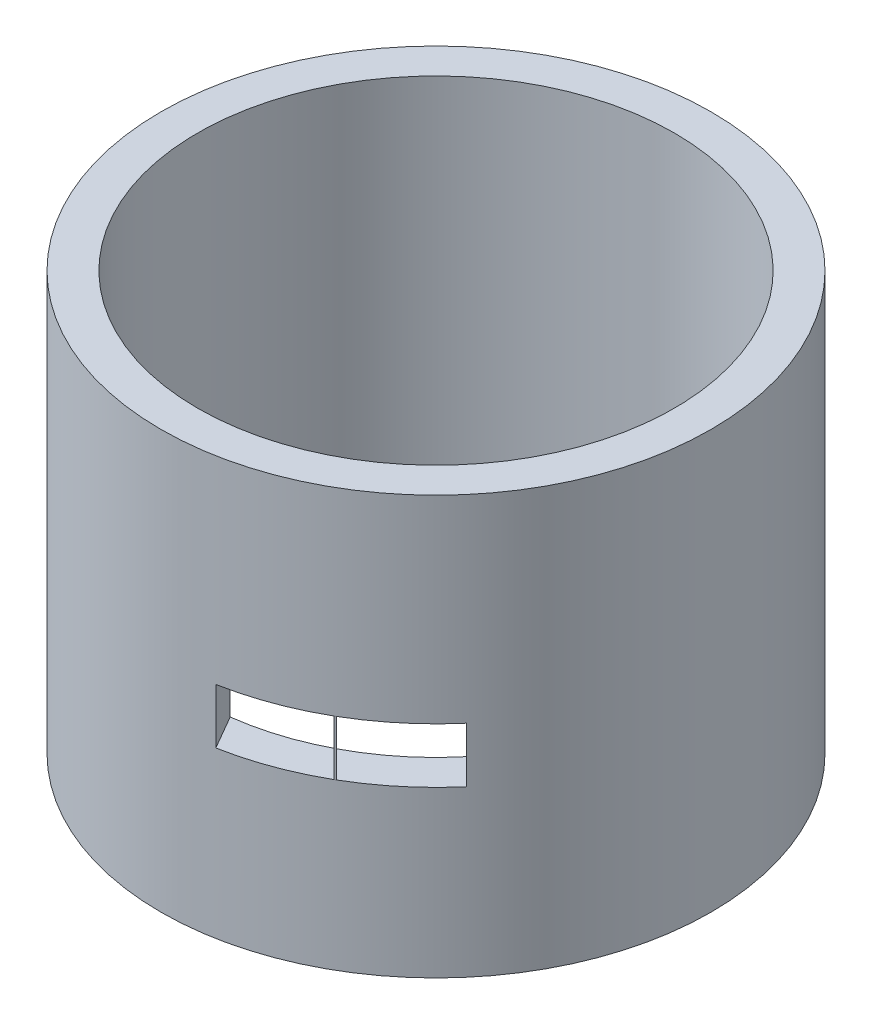
ISO-10303-21;
HEADER;
FILE_DESCRIPTION(('STEP AP214'),'2;1');
FILE_NAME('part.step','',(''),(''),'','','');
FILE_SCHEMA(('AUTOMOTIVE_DESIGN { 1 0 10303 214 1 1 1 1 }'));
ENDSEC;
DATA;
#1=APPLICATION_CONTEXT('core data for automotive mechanical design processes');
#2=APPLICATION_PROTOCOL_DEFINITION('international standard','automotive_design',2000,#1);
#3=PRODUCT_CONTEXT('',#1,'mechanical');
#4=PRODUCT('Part','Part','',(#3));
#5=PRODUCT_RELATED_PRODUCT_CATEGORY('part','',(#4));
#6=PRODUCT_DEFINITION_FORMATION('','',#4);
#7=PRODUCT_DEFINITION_CONTEXT('part definition',#1,'design');
#8=PRODUCT_DEFINITION('design','',#6,#7);
#9=PRODUCT_DEFINITION_SHAPE('','',#8);
#10=(LENGTH_UNIT() NAMED_UNIT(*) SI_UNIT(.MILLI.,.METRE.));
#11=(NAMED_UNIT(*) PLANE_ANGLE_UNIT() SI_UNIT($,.RADIAN.));
#12=(NAMED_UNIT(*) SI_UNIT($,.STERADIAN.) SOLID_ANGLE_UNIT());
#13=UNCERTAINTY_MEASURE_WITH_UNIT(LENGTH_MEASURE(1.E-05),#10,'distance_accuracy_value','');
#14=(GEOMETRIC_REPRESENTATION_CONTEXT(3) GLOBAL_UNCERTAINTY_ASSIGNED_CONTEXT((#13)) GLOBAL_UNIT_ASSIGNED_CONTEXT((#10,
#11,#12)) REPRESENTATION_CONTEXT('',''));
#15=CARTESIAN_POINT('',(0.,0.,0.));
#16=DIRECTION('',(0.,0.,1.));
#17=DIRECTION('',(1.,0.,0.));
#18=AXIS2_PLACEMENT_3D('',#15,#16,#17);
#19=CARTESIAN_POINT('',(0.,114.,0.));
#20=DIRECTION('',(0.,-1.,0.));
#21=DIRECTION('',(0.,0.,-1.));
#22=AXIS2_PLACEMENT_3D('',#19,#20,#21);
#23=CYLINDRICAL_SURFACE('',#22,75.);
#24=CARTESIAN_POINT('',(0.,45.,0.));
#25=DIRECTION('',(0.,-1.,0.));
#26=DIRECTION('',(0.,0.,-1.));
#27=AXIS2_PLACEMENT_3D('',#24,#25,#26);
#28=CIRCLE('',#27,75.);
#29=CARTESIAN_POINT('',(37.2554238093111,45.0000000000005,65.0924987751171));
#30=VERTEX_POINT('',#29);
#31=CARTESIAN_POINT('',(13.7047039647165,45.0000000000005,73.7372435695794));
#32=VERTEX_POINT('',#31);
#33=EDGE_CURVE('E92',#30,#32,#28,.T.);
#34=ORIENTED_EDGE('',*,*,#33,.T.);
#35=DIRECTION('',(0.,-1.,0.));
#36=VECTOR('',#35,1.);
#37=CARTESIAN_POINT('',(13.7047039647165,114.,73.7372435695794));
#38=LINE('',#37,#36);
#39=CARTESIAN_POINT('',(13.7047039647165,60.0000000000005,73.7372435695795));
#40=VERTEX_POINT('',#39);
#41=EDGE_CURVE('E107',#32,#40,#38,.F.);
#42=ORIENTED_EDGE('',*,*,#41,.T.);
#43=CARTESIAN_POINT('',(0.,60.,0.));
#44=DIRECTION('',(0.,1.,0.));
#45=DIRECTION('',(0.,0.,1.));
#46=AXIS2_PLACEMENT_3D('',#43,#44,#45);
#47=CIRCLE('',#46,75.);
#48=CARTESIAN_POINT('',(37.2554238093113,60.0000000000005,65.0924987751174));
#49=VERTEX_POINT('',#48);
#50=EDGE_CURVE('E106',#40,#49,#47,.T.);
#51=ORIENTED_EDGE('',*,*,#50,.T.);
#52=DIRECTION('',(0.,-1.,0.));
#53=VECTOR('',#52,1.);
#54=CARTESIAN_POINT('',(37.2554238093111,114.,65.0924987751171));
#55=LINE('',#54,#53);
#56=EDGE_CURVE('E11',#49,#30,#55,.T.);
#57=ORIENTED_EDGE('',*,*,#56,.T.);
#58=EDGE_LOOP('',(#34,#42,#51,#57));
#59=FACE_BOUND('',#58,.T.);
#60=DIRECTION('',(0.,-1.,0.));
#61=VECTOR('',#60,1.);
#62=CARTESIAN_POINT('',(37.7440456304035,114.,64.8103928351775));
#63=LINE('',#62,#61);
#64=CARTESIAN_POINT('',(37.7440456304037,45.0000000000005,64.8103928351779));
#65=VERTEX_POINT('',#64);
#66=CARTESIAN_POINT('',(37.7440456304035,60.0000000000005,64.8103928351775));
#67=VERTEX_POINT('',#66);
#68=EDGE_CURVE('E39',#65,#67,#63,.F.);
#69=ORIENTED_EDGE('',*,*,#68,.T.);
#70=CARTESIAN_POINT('',(57.0059741539384,60.0000000000005,48.7372435695794));
#71=VERTEX_POINT('',#70);
#72=EDGE_CURVE('E98',#67,#71,#47,.T.);
#73=ORIENTED_EDGE('',*,*,#72,.T.);
#74=DIRECTION('',(0.,-1.,0.));
#75=VECTOR('',#74,1.);
#76=CARTESIAN_POINT('',(57.0059741539384,114.,48.7372435695794));
#77=LINE('',#76,#75);
#78=CARTESIAN_POINT('',(57.0059741539384,45.0000000000005,48.7372435695794));
#79=VERTEX_POINT('',#78);
#80=EDGE_CURVE('E96',#71,#79,#77,.T.);
#81=ORIENTED_EDGE('',*,*,#80,.T.);
#82=EDGE_CURVE('E88',#79,#65,#28,.T.);
#83=ORIENTED_EDGE('',*,*,#82,.T.);
#84=EDGE_LOOP('',(#69,#73,#81,#83));
#85=FACE_BOUND('',#84,.T.);
#86=CARTESIAN_POINT('',(0.,114.,0.));
#87=DIRECTION('',(0.,1.,0.));
#88=DIRECTION('',(0.,0.,1.));
#89=AXIS2_PLACEMENT_3D('',#86,#87,#88);
#90=CIRCLE('',#89,75.);
#91=CARTESIAN_POINT('',(0.,114.,75.));
#92=VERTEX_POINT('',#91);
#93=EDGE_CURVE('E114',#92,#92,#90,.T.);
#94=ORIENTED_EDGE('',*,*,#93,.F.);
#95=EDGE_LOOP('',(#94));
#96=FACE_BOUND('',#95,.T.);
#97=CARTESIAN_POINT('',(0.,0.,0.));
#98=DIRECTION('',(0.,1.,0.));
#99=DIRECTION('',(0.,0.,1.));
#100=AXIS2_PLACEMENT_3D('',#97,#98,#99);
#101=CIRCLE('',#100,75.);
#102=CARTESIAN_POINT('',(0.,0.,75.));
#103=VERTEX_POINT('',#102);
#104=EDGE_CURVE('E118',#103,#103,#101,.T.);
#105=ORIENTED_EDGE('',*,*,#104,.T.);
#106=EDGE_LOOP('',(#105));
#107=FACE_BOUND('',#106,.T.);
#108=ADVANCED_FACE('F32',(#59,#85,#96,#107),#23,.T.);
#109=CARTESIAN_POINT('',(0.,114.,0.));
#110=DIRECTION('',(0.,1.,0.));
#111=DIRECTION('',(0.,0.,1.));
#112=AXIS2_PLACEMENT_3D('',#109,#110,#111);
#113=PLANE('',#112);
#114=CARTESIAN_POINT('',(0.,114.,0.));
#115=DIRECTION('',(0.,1.,0.));
#116=DIRECTION('',(0.,0.,1.));
#117=AXIS2_PLACEMENT_3D('',#114,#115,#116);
#118=CIRCLE('',#117,65.);
#119=CARTESIAN_POINT('',(0.,114.,65.));
#120=VERTEX_POINT('',#119);
#121=EDGE_CURVE('E110',#120,#120,#118,.T.);
#122=ORIENTED_EDGE('',*,*,#121,.F.);
#123=EDGE_LOOP('',(#122));
#124=FACE_BOUND('',#123,.T.);
#125=ORIENTED_EDGE('',*,*,#93,.T.);
#126=EDGE_LOOP('',(#125));
#127=FACE_BOUND('',#126,.T.);
#128=ADVANCED_FACE('F154',(#124,#127),#113,.T.);
#129=CARTESIAN_POINT('',(0.,0.,0.));
#130=DIRECTION('',(0.,1.,0.));
#131=DIRECTION('',(0.,0.,1.));
#132=AXIS2_PLACEMENT_3D('',#129,#130,#131);
#133=PLANE('',#132);
#134=CARTESIAN_POINT('',(0.,0.,0.));
#135=DIRECTION('',(0.,1.,0.));
#136=DIRECTION('',(0.,0.,1.));
#137=AXIS2_PLACEMENT_3D('',#134,#135,#136);
#138=CIRCLE('',#137,65.);
#139=CARTESIAN_POINT('',(0.,0.,65.));
#140=VERTEX_POINT('',#139);
#141=EDGE_CURVE('E113',#140,#140,#138,.T.);
#142=ORIENTED_EDGE('',*,*,#141,.T.);
#143=EDGE_LOOP('',(#142));
#144=FACE_BOUND('',#143,.T.);
#145=ORIENTED_EDGE('',*,*,#104,.F.);
#146=EDGE_LOOP('',(#145));
#147=FACE_BOUND('',#146,.T.);
#148=ADVANCED_FACE('F160',(#144,#147),#133,.F.);
#149=CARTESIAN_POINT('',(0.,-5.99999999999999,0.));
#150=DIRECTION('',(0.,1.,0.));
#151=DIRECTION('',(0.,0.,1.));
#152=AXIS2_PLACEMENT_3D('',#149,#150,#151);
#153=CYLINDRICAL_SURFACE('',#152,65.);
#154=CARTESIAN_POINT('',(0.,60.,0.));
#155=DIRECTION('',(0.,1.,0.));
#156=DIRECTION('',(0.,0.,1.));
#157=AXIS2_PLACEMENT_3D('',#154,#155,#156);
#158=CIRCLE('',#157,65.);
#159=CARTESIAN_POINT('',(51.650635094611,60.0000000000004,39.4615242270662));
#160=VERTEX_POINT('',#159);
#161=CARTESIAN_POINT('',(8.34936490538912,60.0000000000004,64.4615242270663));
#162=VERTEX_POINT('',#161);
#163=EDGE_CURVE('E128',#160,#162,#158,.F.);
#164=ORIENTED_EDGE('',*,*,#163,.T.);
#165=DIRECTION('',(0.,1.,0.));
#166=VECTOR('',#165,1.);
#167=CARTESIAN_POINT('',(8.34936490538914,-6.,64.4615242270663));
#168=LINE('',#167,#166);
#169=CARTESIAN_POINT('',(8.34936490538913,45.0000000000004,64.4615242270663));
#170=VERTEX_POINT('',#169);
#171=EDGE_CURVE('E85',#162,#170,#168,.F.);
#172=ORIENTED_EDGE('',*,*,#171,.T.);
#173=CARTESIAN_POINT('',(0.,45.,0.));
#174=DIRECTION('',(0.,-1.,0.));
#175=DIRECTION('',(0.,0.,-1.));
#176=AXIS2_PLACEMENT_3D('',#173,#174,#175);
#177=CIRCLE('',#176,65.);
#178=CARTESIAN_POINT('',(51.650635094611,45.0000000000004,39.4615242270662));
#179=VERTEX_POINT('',#178);
#180=EDGE_CURVE('E117',#170,#179,#177,.F.);
#181=ORIENTED_EDGE('',*,*,#180,.T.);
#182=DIRECTION('',(0.,1.,0.));
#183=VECTOR('',#182,1.);
#184=CARTESIAN_POINT('',(51.650635094611,-5.99999999999999,39.4615242270662));
#185=LINE('',#184,#183);
#186=EDGE_CURVE('E125',#179,#160,#185,.T.);
#187=ORIENTED_EDGE('',*,*,#186,.T.);
#188=EDGE_LOOP('',(#164,#172,#181,#187));
#189=FACE_BOUND('',#188,.T.);
#190=ORIENTED_EDGE('',*,*,#121,.T.);
#191=EDGE_LOOP('',(#190));
#192=FACE_BOUND('',#191,.T.);
#193=ORIENTED_EDGE('',*,*,#141,.F.);
#194=EDGE_LOOP('',(#193));
#195=FACE_BOUND('',#194,.T.);
#196=ADVANCED_FACE('F133',(#189,#192,#195),#153,.F.);
#197=CARTESIAN_POINT('',(37.4997347198576,4.99329849422246E-13,64.9514458051479));
#198=DIRECTION('',(0.500000000000001,0.,0.866025403784438));
#199=DIRECTION('',(0.866025403784438,0.,-0.500000000000001));
#200=AXIS2_PLACEMENT_3D('',#197,#198,#199);
#201=PLANE('',#200);
#202=DIRECTION('',(-0.866025403784438,0.,0.500000000000001));
#203=VECTOR('',#202,1.);
#204=CARTESIAN_POINT('',(15.8490996252465,60.0000000000005,77.4514458051476));
#205=LINE('',#204,#203);
#206=EDGE_CURVE('E51',#67,#49,#205,.T.);
#207=ORIENTED_EDGE('',*,*,#206,.F.);
#208=ORIENTED_EDGE('',*,*,#68,.F.);
#209=DIRECTION('',(0.866025403784438,0.,-0.500000000000001));
#210=VECTOR('',#209,1.);
#211=CARTESIAN_POINT('',(15.8490996252466,45.0000000000005,77.4514458051477));
#212=LINE('',#211,#210);
#213=EDGE_CURVE('E46',#30,#65,#212,.T.);
#214=ORIENTED_EDGE('',*,*,#213,.F.);
#215=ORIENTED_EDGE('',*,*,#56,.F.);
#216=EDGE_LOOP('',(#207,#208,#214,#215));
#217=FACE_BOUND('',#216,.T.);
#218=ADVANCED_FACE('F81',(#217),#201,.F.);
#219=CARTESIAN_POINT('',(8.34909962524648,60.0000000000004,64.461064748381));
#220=DIRECTION('',(-0.866025403784438,0.,0.500000000000001));
#221=DIRECTION('',(0.500000000000001,0.,0.866025403784438));
#222=AXIS2_PLACEMENT_3D('',#219,#220,#221);
#223=PLANE('',#222);
#224=DIRECTION('',(0.500000000000001,0.,0.866025403784438));
#225=VECTOR('',#224,1.);
#226=CARTESIAN_POINT('',(8.34909962524653,45.0000000000004,64.4610647483811));
#227=LINE('',#226,#225);
#228=EDGE_CURVE('E102',#170,#32,#227,.T.);
#229=ORIENTED_EDGE('',*,*,#228,.F.);
#230=ORIENTED_EDGE('',*,*,#171,.F.);
#231=DIRECTION('',(0.500000000000001,0.,0.866025403784438));
#232=VECTOR('',#231,1.);
#233=CARTESIAN_POINT('',(8.34909962524648,60.0000000000004,64.461064748381));
#234=LINE('',#233,#232);
#235=EDGE_CURVE('E100',#162,#40,#234,.T.);
#236=ORIENTED_EDGE('',*,*,#235,.T.);
#237=ORIENTED_EDGE('',*,*,#41,.F.);
#238=EDGE_LOOP('',(#229,#230,#236,#237));
#239=FACE_BOUND('',#238,.T.);
#240=ADVANCED_FACE('F139',(#239),#223,.F.);
#241=CARTESIAN_POINT('',(8.34909962524648,60.0000000000004,64.461064748381));
#242=DIRECTION('',(0.,1.,0.));
#243=DIRECTION('',(0.,0.,1.));
#244=AXIS2_PLACEMENT_3D('',#241,#242,#243);
#245=PLANE('',#244);
#246=ORIENTED_EDGE('',*,*,#235,.F.);
#247=ORIENTED_EDGE('',*,*,#163,.F.);
#248=DIRECTION('',(0.500000000000001,0.,0.866025403784438));
#249=VECTOR('',#248,1.);
#250=CARTESIAN_POINT('',(51.6503698144684,60.0000000000004,39.461064748381));
#251=LINE('',#250,#249);
#252=EDGE_CURVE('E145',#160,#71,#251,.T.);
#253=ORIENTED_EDGE('',*,*,#252,.T.);
#254=ORIENTED_EDGE('',*,*,#72,.F.);
#255=ORIENTED_EDGE('',*,*,#206,.T.);
#256=ORIENTED_EDGE('',*,*,#50,.F.);
#257=EDGE_LOOP('',(#246,#247,#253,#254,#255,#256));
#258=FACE_BOUND('',#257,.T.);
#259=ADVANCED_FACE('F141',(#258),#245,.F.);
#260=CARTESIAN_POINT('',(51.6503698144684,60.0000000000004,39.461064748381));
#261=DIRECTION('',(0.866025403784438,0.,-0.500000000000001));
#262=DIRECTION('',(-0.500000000000001,0.,-0.866025403784438));
#263=AXIS2_PLACEMENT_3D('',#260,#261,#262);
#264=PLANE('',#263);
#265=ORIENTED_EDGE('',*,*,#252,.F.);
#266=ORIENTED_EDGE('',*,*,#186,.F.);
#267=DIRECTION('',(0.500000000000001,0.,0.866025403784438));
#268=VECTOR('',#267,1.);
#269=CARTESIAN_POINT('',(51.6503698144684,45.0000000000004,39.4610647483811));
#270=LINE('',#269,#268);
#271=EDGE_CURVE('E147',#179,#79,#270,.T.);
#272=ORIENTED_EDGE('',*,*,#271,.T.);
#273=ORIENTED_EDGE('',*,*,#80,.F.);
#274=EDGE_LOOP('',(#265,#266,#272,#273));
#275=FACE_BOUND('',#274,.T.);
#276=ADVANCED_FACE('F175',(#275),#264,.F.);
#277=CARTESIAN_POINT('',(8.34909962524653,45.0000000000004,64.4610647483811));
#278=DIRECTION('',(0.,-1.,0.));
#279=DIRECTION('',(0.,0.,-1.));
#280=AXIS2_PLACEMENT_3D('',#277,#278,#279);
#281=PLANE('',#280);
#282=ORIENTED_EDGE('',*,*,#271,.F.);
#283=ORIENTED_EDGE('',*,*,#180,.F.);
#284=ORIENTED_EDGE('',*,*,#228,.T.);
#285=ORIENTED_EDGE('',*,*,#33,.F.);
#286=ORIENTED_EDGE('',*,*,#213,.T.);
#287=ORIENTED_EDGE('',*,*,#82,.F.);
#288=EDGE_LOOP('',(#282,#283,#284,#285,#286,#287));
#289=FACE_BOUND('',#288,.T.);
#290=ADVANCED_FACE('F87',(#289),#281,.F.);
#291=CLOSED_SHELL('',(#108,#128,#148,#196,#218,#240,#259,#276,#290));
#292=MANIFOLD_SOLID_BREP('B2',#291);
#293=ADVANCED_BREP_SHAPE_REPRESENTATION('',(#18,#292),#14);
#294=SHAPE_DEFINITION_REPRESENTATION(#9,#293);
ENDSEC;
END-ISO-10303-21;
